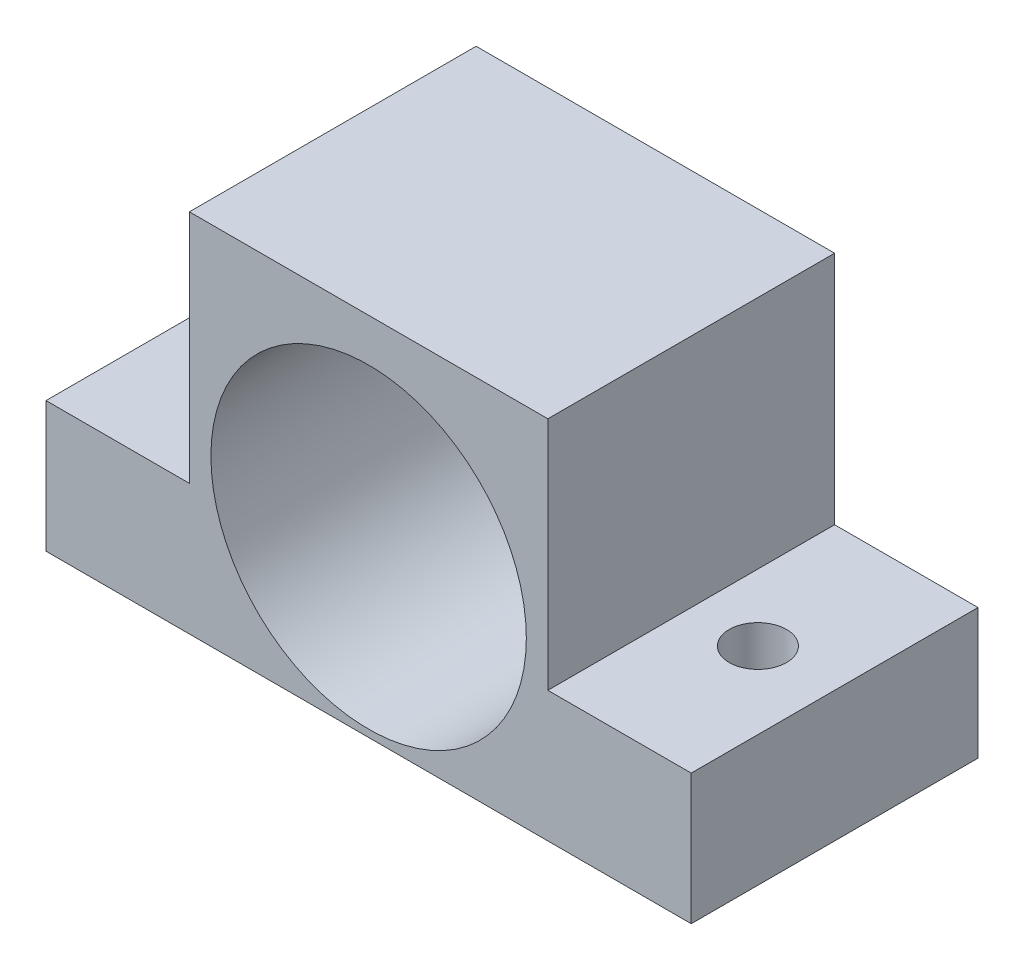
ISO-10303-21;
HEADER;
FILE_DESCRIPTION(('STEP AP214'),'2;1');
FILE_NAME('part.step','',(''),(''),'','','');
FILE_SCHEMA(('AUTOMOTIVE_DESIGN { 1 0 10303 214 1 1 1 1 }'));
ENDSEC;
DATA;
#1=APPLICATION_CONTEXT('core data for automotive mechanical design processes');
#2=APPLICATION_PROTOCOL_DEFINITION('international standard','automotive_design',2000,#1);
#3=PRODUCT_CONTEXT('',#1,'mechanical');
#4=PRODUCT('Part','Part','',(#3));
#5=PRODUCT_RELATED_PRODUCT_CATEGORY('part','',(#4));
#6=PRODUCT_DEFINITION_FORMATION('','',#4);
#7=PRODUCT_DEFINITION_CONTEXT('part definition',#1,'design');
#8=PRODUCT_DEFINITION('design','',#6,#7);
#9=PRODUCT_DEFINITION_SHAPE('','',#8);
#10=(LENGTH_UNIT() NAMED_UNIT(*) SI_UNIT(.MILLI.,.METRE.));
#11=(NAMED_UNIT(*) PLANE_ANGLE_UNIT() SI_UNIT($,.RADIAN.));
#12=(NAMED_UNIT(*) SI_UNIT($,.STERADIAN.) SOLID_ANGLE_UNIT());
#13=UNCERTAINTY_MEASURE_WITH_UNIT(LENGTH_MEASURE(1.E-05),#10,'distance_accuracy_value','');
#14=(GEOMETRIC_REPRESENTATION_CONTEXT(3) GLOBAL_UNCERTAINTY_ASSIGNED_CONTEXT((#13)) GLOBAL_UNIT_ASSIGNED_CONTEXT((#10,
#11,#12)) REPRESENTATION_CONTEXT('',''));
#15=CARTESIAN_POINT('',(0.,0.,0.));
#16=DIRECTION('',(0.,0.,1.));
#17=DIRECTION('',(1.,0.,0.));
#18=AXIS2_PLACEMENT_3D('',#15,#16,#17);
#19=CARTESIAN_POINT('',(13.5517462273226,0.,20.));
#20=DIRECTION('',(1.,0.,0.));
#21=DIRECTION('',(0.,1.,0.));
#22=AXIS2_PLACEMENT_3D('',#19,#20,#21);
#23=PLANE('',#22);
#24=DIRECTION('',(0.,-1.,0.));
#25=VECTOR('',#24,1.);
#26=CARTESIAN_POINT('',(13.5517462273226,0.,0.));
#27=LINE('',#26,#25);
#28=CARTESIAN_POINT('',(13.5517462273226,8.00000000000012,0.));
#29=VERTEX_POINT('',#28);
#30=CARTESIAN_POINT('',(13.5517462273226,-8.39999999999993,0.));
#31=VERTEX_POINT('',#30);
#32=EDGE_CURVE('E154',#29,#31,#27,.T.);
#33=ORIENTED_EDGE('',*,*,#32,.F.);
#34=DIRECTION('',(0.,0.,-1.));
#35=VECTOR('',#34,1.);
#36=CARTESIAN_POINT('',(13.5517462273226,8.00000000000012,20.));
#37=LINE('',#36,#35);
#38=CARTESIAN_POINT('',(13.5517462273226,8.00000000000012,20.));
#39=VERTEX_POINT('',#38);
#40=EDGE_CURVE('E11',#39,#29,#37,.T.);
#41=ORIENTED_EDGE('',*,*,#40,.F.);
#42=DIRECTION('',(0.,-1.,0.));
#43=VECTOR('',#42,1.);
#44=CARTESIAN_POINT('',(13.5517462273226,0.,20.));
#45=LINE('',#44,#43);
#46=CARTESIAN_POINT('',(13.5517462273226,-8.39999999999993,20.));
#47=VERTEX_POINT('',#46);
#48=EDGE_CURVE('E190',#39,#47,#45,.T.);
#49=ORIENTED_EDGE('',*,*,#48,.T.);
#50=DIRECTION('',(0.,0.,-1.));
#51=VECTOR('',#50,1.);
#52=CARTESIAN_POINT('',(13.5517462273226,-8.39999999999993,20.));
#53=LINE('',#52,#51);
#54=EDGE_CURVE('E51',#47,#31,#53,.T.);
#55=ORIENTED_EDGE('',*,*,#54,.T.);
#56=EDGE_LOOP('',(#33,#41,#49,#55));
#57=FACE_BOUND('',#56,.T.);
#58=ADVANCED_FACE('F34',(#57),#23,.T.);
#59=CARTESIAN_POINT('',(0.,8.00000000000012,20.));
#60=DIRECTION('',(0.,1.,0.));
#61=DIRECTION('',(0.,0.,1.));
#62=AXIS2_PLACEMENT_3D('',#59,#60,#61);
#63=PLANE('',#62);
#64=DIRECTION('',(1.,0.,0.));
#65=VECTOR('',#64,1.);
#66=CARTESIAN_POINT('',(0.,8.00000000000012,0.));
#67=LINE('',#66,#65);
#68=CARTESIAN_POINT('',(-11.4482537726774,8.00000000000012,0.));
#69=VERTEX_POINT('',#68);
#70=EDGE_CURVE('E148',#69,#29,#67,.T.);
#71=ORIENTED_EDGE('',*,*,#70,.F.);
#72=DIRECTION('',(0.,0.,-1.));
#73=VECTOR('',#72,1.);
#74=CARTESIAN_POINT('',(-11.4482537726774,8.00000000000012,20.));
#75=LINE('',#74,#73);
#76=CARTESIAN_POINT('',(-11.4482537726774,8.00000000000012,20.));
#77=VERTEX_POINT('',#76);
#78=EDGE_CURVE('E43',#77,#69,#75,.T.);
#79=ORIENTED_EDGE('',*,*,#78,.F.);
#80=DIRECTION('',(1.,0.,0.));
#81=VECTOR('',#80,1.);
#82=CARTESIAN_POINT('',(0.,8.00000000000012,20.));
#83=LINE('',#82,#81);
#84=EDGE_CURVE('E192',#77,#39,#83,.T.);
#85=ORIENTED_EDGE('',*,*,#84,.T.);
#86=ORIENTED_EDGE('',*,*,#40,.T.);
#87=EDGE_LOOP('',(#71,#79,#85,#86));
#88=FACE_BOUND('',#87,.T.);
#89=ADVANCED_FACE('F153',(#88),#63,.T.);
#90=CARTESIAN_POINT('',(-11.4482537726774,0.,20.));
#91=DIRECTION('',(1.,0.,0.));
#92=DIRECTION('',(0.,1.,0.));
#93=AXIS2_PLACEMENT_3D('',#90,#91,#92);
#94=PLANE('',#93);
#95=DIRECTION('',(0.,-1.,0.));
#96=VECTOR('',#95,1.);
#97=CARTESIAN_POINT('',(-11.4482537726774,0.,0.));
#98=LINE('',#97,#96);
#99=CARTESIAN_POINT('',(-11.4482537726774,-8.39999999999993,0.));
#100=VERTEX_POINT('',#99);
#101=EDGE_CURVE('E138',#69,#100,#98,.T.);
#102=ORIENTED_EDGE('',*,*,#101,.T.);
#103=DIRECTION('',(0.,0.,-1.));
#104=VECTOR('',#103,1.);
#105=CARTESIAN_POINT('',(-11.4482537726774,-8.39999999999993,20.));
#106=LINE('',#105,#104);
#107=CARTESIAN_POINT('',(-11.4482537726774,-8.39999999999993,20.));
#108=VERTEX_POINT('',#107);
#109=EDGE_CURVE('E130',#108,#100,#106,.T.);
#110=ORIENTED_EDGE('',*,*,#109,.F.);
#111=DIRECTION('',(0.,-1.,0.));
#112=VECTOR('',#111,1.);
#113=CARTESIAN_POINT('',(-11.4482537726774,0.,20.));
#114=LINE('',#113,#112);
#115=EDGE_CURVE('E140',#77,#108,#114,.T.);
#116=ORIENTED_EDGE('',*,*,#115,.F.);
#117=ORIENTED_EDGE('',*,*,#78,.T.);
#118=EDGE_LOOP('',(#102,#110,#116,#117));
#119=FACE_BOUND('',#118,.T.);
#120=ADVANCED_FACE('F136',(#119),#94,.F.);
#121=CARTESIAN_POINT('',(0.,-8.39999999999993,20.));
#122=DIRECTION('',(0.,-1.,0.));
#123=DIRECTION('',(1.,0.,0.));
#124=AXIS2_PLACEMENT_3D('',#121,#122,#123);
#125=PLANE('',#124);
#126=CARTESIAN_POINT('',(-16.7988358484516,-8.39999999999993,10.));
#127=DIRECTION('',(0.,1.,0.));
#128=DIRECTION('',(-1.,0.,0.));
#129=AXIS2_PLACEMENT_3D('',#126,#127,#128);
#130=CIRCLE('',#129,2.);
#131=CARTESIAN_POINT('',(-18.7988358484516,-8.39999999999993,10.));
#132=VERTEX_POINT('',#131);
#133=EDGE_CURVE('E175',#132,#132,#130,.T.);
#134=ORIENTED_EDGE('',*,*,#133,.F.);
#135=EDGE_LOOP('',(#134));
#136=FACE_BOUND('',#135,.T.);
#137=DIRECTION('',(-1.,0.,0.));
#138=VECTOR('',#137,1.);
#139=CARTESIAN_POINT('',(0.,-8.39999999999993,0.));
#140=LINE('',#139,#138);
#141=CARTESIAN_POINT('',(-21.4482537726774,-8.39999999999994,0.));
#142=VERTEX_POINT('',#141);
#143=EDGE_CURVE('E151',#100,#142,#140,.T.);
#144=ORIENTED_EDGE('',*,*,#143,.T.);
#145=DIRECTION('',(0.,0.,-1.));
#146=VECTOR('',#145,1.);
#147=CARTESIAN_POINT('',(-21.4482537726774,-8.39999999999994,20.));
#148=LINE('',#147,#146);
#149=CARTESIAN_POINT('',(-21.4482537726774,-8.39999999999994,20.));
#150=VERTEX_POINT('',#149);
#151=EDGE_CURVE('E124',#150,#142,#148,.T.);
#152=ORIENTED_EDGE('',*,*,#151,.F.);
#153=DIRECTION('',(-1.,0.,0.));
#154=VECTOR('',#153,1.);
#155=CARTESIAN_POINT('',(0.,-8.39999999999993,20.));
#156=LINE('',#155,#154);
#157=EDGE_CURVE('E195',#108,#150,#156,.T.);
#158=ORIENTED_EDGE('',*,*,#157,.F.);
#159=ORIENTED_EDGE('',*,*,#109,.T.);
#160=EDGE_LOOP('',(#144,#152,#158,#159));
#161=FACE_BOUND('',#160,.T.);
#162=ADVANCED_FACE('F223',(#136,#161),#125,.F.);
#163=CARTESIAN_POINT('',(-21.4482537726774,0.,20.));
#164=DIRECTION('',(-1.,0.,0.));
#165=DIRECTION('',(0.,0.,1.));
#166=AXIS2_PLACEMENT_3D('',#163,#164,#165);
#167=PLANE('',#166);
#168=DIRECTION('',(0.,1.,0.));
#169=VECTOR('',#168,1.);
#170=CARTESIAN_POINT('',(-21.4482537726774,0.,0.));
#171=LINE('',#170,#169);
#172=CARTESIAN_POINT('',(-21.4482537726774,-17.4999999999999,0.));
#173=VERTEX_POINT('',#172);
#174=EDGE_CURVE('E161',#173,#142,#171,.T.);
#175=ORIENTED_EDGE('',*,*,#174,.F.);
#176=DIRECTION('',(0.,0.,-1.));
#177=VECTOR('',#176,1.);
#178=CARTESIAN_POINT('',(-21.4482537726774,-17.4999999999999,20.));
#179=LINE('',#178,#177);
#180=CARTESIAN_POINT('',(-21.4482537726774,-17.4999999999999,20.));
#181=VERTEX_POINT('',#180);
#182=EDGE_CURVE('E122',#181,#173,#179,.T.);
#183=ORIENTED_EDGE('',*,*,#182,.F.);
#184=DIRECTION('',(0.,1.,0.));
#185=VECTOR('',#184,1.);
#186=CARTESIAN_POINT('',(-21.4482537726774,0.,20.));
#187=LINE('',#186,#185);
#188=EDGE_CURVE('E116',#181,#150,#187,.T.);
#189=ORIENTED_EDGE('',*,*,#188,.T.);
#190=ORIENTED_EDGE('',*,*,#151,.T.);
#191=EDGE_LOOP('',(#175,#183,#189,#190));
#192=FACE_BOUND('',#191,.T.);
#193=ADVANCED_FACE('F199',(#192),#167,.T.);
#194=CARTESIAN_POINT('',(0.,-17.4999999999999,20.));
#195=DIRECTION('',(0.,1.,0.));
#196=DIRECTION('',(0.,0.,1.));
#197=AXIS2_PLACEMENT_3D('',#194,#195,#196);
#198=PLANE('',#197);
#199=DIRECTION('',(1.,0.,0.));
#200=VECTOR('',#199,1.);
#201=CARTESIAN_POINT('',(0.,-17.4999999999999,0.));
#202=LINE('',#201,#200);
#203=CARTESIAN_POINT('',(23.5517462273227,-17.4999999999999,0.));
#204=VERTEX_POINT('',#203);
#205=EDGE_CURVE('E121',#173,#204,#202,.T.);
#206=ORIENTED_EDGE('',*,*,#205,.T.);
#207=DIRECTION('',(0.,0.,-1.));
#208=VECTOR('',#207,1.);
#209=CARTESIAN_POINT('',(23.5517462273227,-17.4999999999999,20.));
#210=LINE('',#209,#208);
#211=CARTESIAN_POINT('',(23.5517462273227,-17.4999999999999,20.));
#212=VERTEX_POINT('',#211);
#213=EDGE_CURVE('E105',#212,#204,#210,.T.);
#214=ORIENTED_EDGE('',*,*,#213,.F.);
#215=DIRECTION('',(1.,0.,0.));
#216=VECTOR('',#215,1.);
#217=CARTESIAN_POINT('',(0.,-17.4999999999999,20.));
#218=LINE('',#217,#216);
#219=EDGE_CURVE('E110',#181,#212,#218,.T.);
#220=ORIENTED_EDGE('',*,*,#219,.F.);
#221=ORIENTED_EDGE('',*,*,#182,.T.);
#222=EDGE_LOOP('',(#206,#214,#220,#221));
#223=FACE_BOUND('',#222,.T.);
#224=ADVANCED_FACE('F119',(#223),#198,.F.);
#225=CARTESIAN_POINT('',(23.5517462273227,0.,20.));
#226=DIRECTION('',(-1.,0.,0.));
#227=DIRECTION('',(0.,0.,1.));
#228=AXIS2_PLACEMENT_3D('',#225,#226,#227);
#229=PLANE('',#228);
#230=DIRECTION('',(0.,1.,0.));
#231=VECTOR('',#230,1.);
#232=CARTESIAN_POINT('',(23.5517462273227,0.,0.));
#233=LINE('',#232,#231);
#234=CARTESIAN_POINT('',(23.5517462273227,-8.39999999999993,0.));
#235=VERTEX_POINT('',#234);
#236=EDGE_CURVE('E164',#204,#235,#233,.T.);
#237=ORIENTED_EDGE('',*,*,#236,.T.);
#238=DIRECTION('',(0.,0.,-1.));
#239=VECTOR('',#238,1.);
#240=CARTESIAN_POINT('',(23.5517462273227,-8.39999999999993,20.));
#241=LINE('',#240,#239);
#242=CARTESIAN_POINT('',(23.5517462273227,-8.39999999999993,20.));
#243=VERTEX_POINT('',#242);
#244=EDGE_CURVE('E77',#243,#235,#241,.T.);
#245=ORIENTED_EDGE('',*,*,#244,.F.);
#246=DIRECTION('',(0.,1.,0.));
#247=VECTOR('',#246,1.);
#248=CARTESIAN_POINT('',(23.5517462273227,0.,20.));
#249=LINE('',#248,#247);
#250=EDGE_CURVE('E101',#212,#243,#249,.T.);
#251=ORIENTED_EDGE('',*,*,#250,.F.);
#252=ORIENTED_EDGE('',*,*,#213,.T.);
#253=EDGE_LOOP('',(#237,#245,#251,#252));
#254=FACE_BOUND('',#253,.T.);
#255=ADVANCED_FACE('F103',(#254),#229,.F.);
#256=CARTESIAN_POINT('',(1.05174622732265,-5.99999999999988,20.));
#257=DIRECTION('',(0.,0.,-1.));
#258=DIRECTION('',(-1.,0.,0.));
#259=AXIS2_PLACEMENT_3D('',#256,#257,#258);
#260=CYLINDRICAL_SURFACE('',#259,11.);
#261=CARTESIAN_POINT('',(1.05174622732265,-5.99999999999988,20.));
#262=DIRECTION('',(0.,0.,1.));
#263=DIRECTION('',(1.,0.,0.));
#264=AXIS2_PLACEMENT_3D('',#261,#262,#263);
#265=CIRCLE('',#264,11.);
#266=CARTESIAN_POINT('',(12.0517462273226,-5.99999999999988,20.));
#267=VERTEX_POINT('',#266);
#268=EDGE_CURVE('E168',#267,#267,#265,.T.);
#269=ORIENTED_EDGE('',*,*,#268,.T.);
#270=EDGE_LOOP('',(#269));
#271=FACE_BOUND('',#270,.T.);
#272=CARTESIAN_POINT('',(1.05174622732265,-5.99999999999988,0.));
#273=DIRECTION('',(0.,0.,1.));
#274=DIRECTION('',(1.,0.,0.));
#275=AXIS2_PLACEMENT_3D('',#272,#273,#274);
#276=CIRCLE('',#275,11.);
#277=CARTESIAN_POINT('',(12.0517462273226,-5.99999999999988,0.));
#278=VERTEX_POINT('',#277);
#279=EDGE_CURVE('E156',#278,#278,#276,.T.);
#280=ORIENTED_EDGE('',*,*,#279,.F.);
#281=EDGE_LOOP('',(#280));
#282=FACE_BOUND('',#281,.T.);
#283=ADVANCED_FACE('F36',(#271,#282),#260,.F.);
#284=CARTESIAN_POINT('',(0.,-8.39999999999993,20.));
#285=DIRECTION('',(0.,1.,0.));
#286=DIRECTION('',(0.,0.,1.));
#287=AXIS2_PLACEMENT_3D('',#284,#285,#286);
#288=PLANE('',#287);
#289=CARTESIAN_POINT('',(18.2011641515484,-8.39999999999993,10.));
#290=DIRECTION('',(0.,1.,0.));
#291=DIRECTION('',(-1.,0.,0.));
#292=AXIS2_PLACEMENT_3D('',#289,#290,#291);
#293=CIRCLE('',#292,2.);
#294=CARTESIAN_POINT('',(16.2011641515484,-8.39999999999993,10.));
#295=VERTEX_POINT('',#294);
#296=EDGE_CURVE('E180',#295,#295,#293,.T.);
#297=ORIENTED_EDGE('',*,*,#296,.F.);
#298=EDGE_LOOP('',(#297));
#299=FACE_BOUND('',#298,.T.);
#300=DIRECTION('',(1.,0.,0.));
#301=VECTOR('',#300,1.);
#302=CARTESIAN_POINT('',(0.,-8.39999999999993,0.));
#303=LINE('',#302,#301);
#304=EDGE_CURVE('E166',#31,#235,#303,.T.);
#305=ORIENTED_EDGE('',*,*,#304,.F.);
#306=ORIENTED_EDGE('',*,*,#54,.F.);
#307=DIRECTION('',(1.,0.,0.));
#308=VECTOR('',#307,1.);
#309=CARTESIAN_POINT('',(0.,-8.39999999999993,20.));
#310=LINE('',#309,#308);
#311=EDGE_CURVE('E109',#47,#243,#310,.T.);
#312=ORIENTED_EDGE('',*,*,#311,.T.);
#313=ORIENTED_EDGE('',*,*,#244,.T.);
#314=EDGE_LOOP('',(#305,#306,#312,#313));
#315=FACE_BOUND('',#314,.T.);
#316=ADVANCED_FACE('F201',(#299,#315),#288,.T.);
#317=CARTESIAN_POINT('',(0.,0.,20.));
#318=DIRECTION('',(0.,0.,1.));
#319=DIRECTION('',(1.,0.,0.));
#320=AXIS2_PLACEMENT_3D('',#317,#318,#319);
#321=PLANE('',#320);
#322=ORIENTED_EDGE('',*,*,#268,.F.);
#323=EDGE_LOOP('',(#322));
#324=FACE_BOUND('',#323,.T.);
#325=ORIENTED_EDGE('',*,*,#48,.F.);
#326=ORIENTED_EDGE('',*,*,#84,.F.);
#327=ORIENTED_EDGE('',*,*,#115,.T.);
#328=ORIENTED_EDGE('',*,*,#157,.T.);
#329=ORIENTED_EDGE('',*,*,#188,.F.);
#330=ORIENTED_EDGE('',*,*,#219,.T.);
#331=ORIENTED_EDGE('',*,*,#250,.T.);
#332=ORIENTED_EDGE('',*,*,#311,.F.);
#333=EDGE_LOOP('',(#325,#326,#327,#328,#329,#330,#331,#332));
#334=FACE_BOUND('',#333,.T.);
#335=ADVANCED_FACE('F114',(#324,#334),#321,.T.);
#336=CARTESIAN_POINT('',(0.,0.,0.));
#337=DIRECTION('',(0.,0.,1.));
#338=DIRECTION('',(1.,0.,0.));
#339=AXIS2_PLACEMENT_3D('',#336,#337,#338);
#340=PLANE('',#339);
#341=ORIENTED_EDGE('',*,*,#279,.T.);
#342=EDGE_LOOP('',(#341));
#343=FACE_BOUND('',#342,.T.);
#344=ORIENTED_EDGE('',*,*,#32,.T.);
#345=ORIENTED_EDGE('',*,*,#304,.T.);
#346=ORIENTED_EDGE('',*,*,#236,.F.);
#347=ORIENTED_EDGE('',*,*,#205,.F.);
#348=ORIENTED_EDGE('',*,*,#174,.T.);
#349=ORIENTED_EDGE('',*,*,#143,.F.);
#350=ORIENTED_EDGE('',*,*,#101,.F.);
#351=ORIENTED_EDGE('',*,*,#70,.T.);
#352=EDGE_LOOP('',(#344,#345,#346,#347,#348,#349,#350,#351));
#353=FACE_BOUND('',#352,.T.);
#354=ADVANCED_FACE('F147',(#343,#353),#340,.F.);
#355=CARTESIAN_POINT('',(18.2011641515484,-17.3999999999999,10.));
#356=DIRECTION('',(0.,1.,0.));
#357=DIRECTION('',(-1.,0.,0.));
#358=AXIS2_PLACEMENT_3D('',#355,#356,#357);
#359=CYLINDRICAL_SURFACE('',#358,2.);
#360=CARTESIAN_POINT('',(18.2011641515484,-17.3999999999999,10.));
#361=DIRECTION('',(0.,1.,0.));
#362=DIRECTION('',(-1.,0.,0.));
#363=AXIS2_PLACEMENT_3D('',#360,#361,#362);
#364=CIRCLE('',#363,2.);
#365=CARTESIAN_POINT('',(16.2011641515484,-17.3999999999999,10.));
#366=VERTEX_POINT('',#365);
#367=EDGE_CURVE('E185',#366,#366,#364,.T.);
#368=ORIENTED_EDGE('',*,*,#367,.F.);
#369=EDGE_LOOP('',(#368));
#370=FACE_BOUND('',#369,.T.);
#371=ORIENTED_EDGE('',*,*,#296,.T.);
#372=EDGE_LOOP('',(#371));
#373=FACE_BOUND('',#372,.T.);
#374=ADVANCED_FACE('F257',(#370,#373),#359,.F.);
#375=CARTESIAN_POINT('',(18.2011641515484,-17.3999999999999,10.));
#376=DIRECTION('',(0.,1.,0.));
#377=DIRECTION('',(-1.,0.,0.));
#378=AXIS2_PLACEMENT_3D('',#375,#376,#377);
#379=PLANE('',#378);
#380=ORIENTED_EDGE('',*,*,#367,.T.);
#381=EDGE_LOOP('',(#380));
#382=FACE_BOUND('',#381,.T.);
#383=ADVANCED_FACE('F278',(#382),#379,.T.);
#384=CARTESIAN_POINT('',(-16.7988358484516,-17.3999999999999,10.));
#385=DIRECTION('',(0.,1.,0.));
#386=DIRECTION('',(-1.,0.,0.));
#387=AXIS2_PLACEMENT_3D('',#384,#385,#386);
#388=CYLINDRICAL_SURFACE('',#387,2.);
#389=CARTESIAN_POINT('',(-16.7988358484516,-17.3999999999999,10.));
#390=DIRECTION('',(0.,1.,0.));
#391=DIRECTION('',(-1.,0.,0.));
#392=AXIS2_PLACEMENT_3D('',#389,#390,#391);
#393=CIRCLE('',#392,2.);
#394=CARTESIAN_POINT('',(-18.7988358484516,-17.3999999999999,10.));
#395=VERTEX_POINT('',#394);
#396=EDGE_CURVE('E171',#395,#395,#393,.T.);
#397=ORIENTED_EDGE('',*,*,#396,.F.);
#398=EDGE_LOOP('',(#397));
#399=FACE_BOUND('',#398,.T.);
#400=ORIENTED_EDGE('',*,*,#133,.T.);
#401=EDGE_LOOP('',(#400));
#402=FACE_BOUND('',#401,.T.);
#403=ADVANCED_FACE('F288',(#399,#402),#388,.F.);
#404=CARTESIAN_POINT('',(0.,-17.3999999999999,0.));
#405=DIRECTION('',(0.,1.,0.));
#406=DIRECTION('',(-1.,0.,0.));
#407=AXIS2_PLACEMENT_3D('',#404,#405,#406);
#408=PLANE('',#407);
#409=ORIENTED_EDGE('',*,*,#396,.T.);
#410=EDGE_LOOP('',(#409));
#411=FACE_BOUND('',#410,.T.);
#412=ADVANCED_FACE('F298',(#411),#408,.T.);
#413=CLOSED_SHELL('',(#58,#89,#120,#162,#193,#224,#255,#283,#316,#335,#354,#374,#383,#403,#412));
#414=MANIFOLD_SOLID_BREP('B2',#413);
#415=ADVANCED_BREP_SHAPE_REPRESENTATION('',(#18,#414),#14);
#416=SHAPE_DEFINITION_REPRESENTATION(#9,#415);
ENDSEC;
END-ISO-10303-21;
